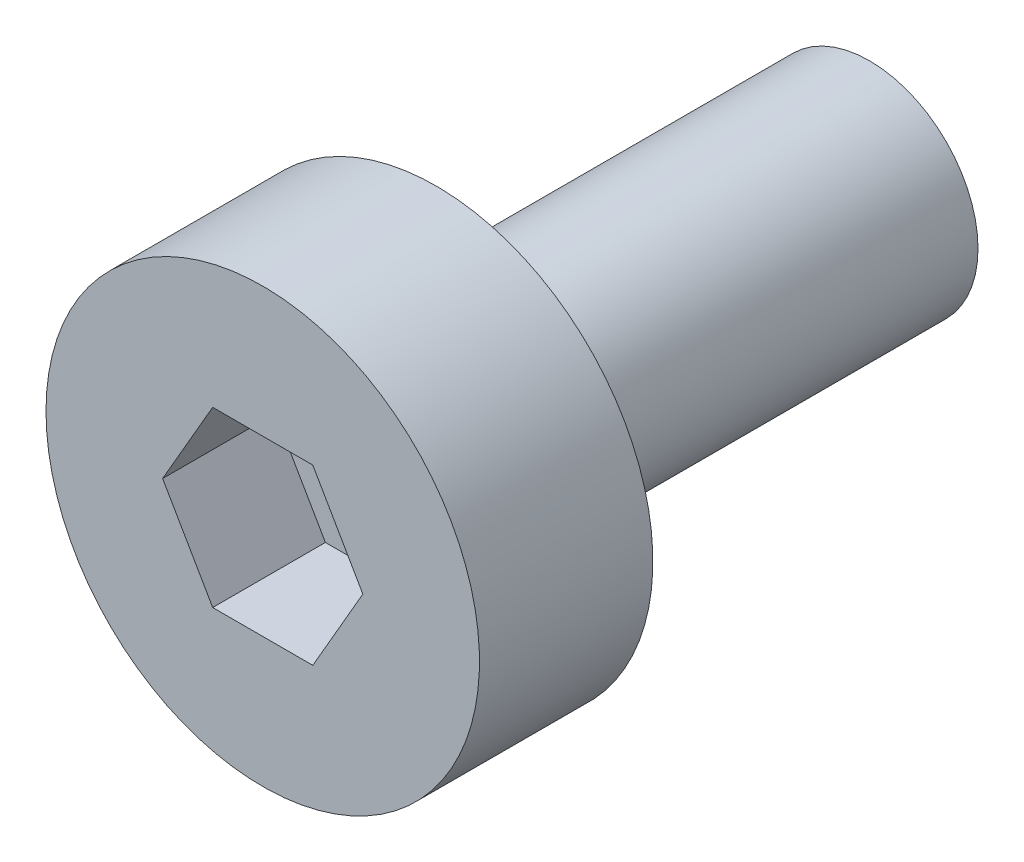
ISO-10303-21;
HEADER;
FILE_DESCRIPTION(('STEP AP214'),'2;1');
FILE_NAME('part.step','',(''),(''),'','','');
FILE_SCHEMA(('AUTOMOTIVE_DESIGN { 1 0 10303 214 1 1 1 1 }'));
ENDSEC;
DATA;
#1=APPLICATION_CONTEXT('core data for automotive mechanical design processes');
#2=APPLICATION_PROTOCOL_DEFINITION('international standard','automotive_design',2000,#1);
#3=PRODUCT_CONTEXT('',#1,'mechanical');
#4=PRODUCT('Part','Part','',(#3));
#5=PRODUCT_RELATED_PRODUCT_CATEGORY('part','',(#4));
#6=PRODUCT_DEFINITION_FORMATION('','',#4);
#7=PRODUCT_DEFINITION_CONTEXT('part definition',#1,'design');
#8=PRODUCT_DEFINITION('design','',#6,#7);
#9=PRODUCT_DEFINITION_SHAPE('','',#8);
#10=(LENGTH_UNIT() NAMED_UNIT(*) SI_UNIT(.MILLI.,.METRE.));
#11=(NAMED_UNIT(*) PLANE_ANGLE_UNIT() SI_UNIT($,.RADIAN.));
#12=(NAMED_UNIT(*) SI_UNIT($,.STERADIAN.) SOLID_ANGLE_UNIT());
#13=UNCERTAINTY_MEASURE_WITH_UNIT(LENGTH_MEASURE(1.E-05),#10,'distance_accuracy_value','');
#14=(GEOMETRIC_REPRESENTATION_CONTEXT(3) GLOBAL_UNCERTAINTY_ASSIGNED_CONTEXT((#13)) GLOBAL_UNIT_ASSIGNED_CONTEXT((#10,
#11,#12)) REPRESENTATION_CONTEXT('',''));
#15=CARTESIAN_POINT('',(0.,0.,0.));
#16=DIRECTION('',(0.,0.,1.));
#17=DIRECTION('',(1.,0.,0.));
#18=AXIS2_PLACEMENT_3D('',#15,#16,#17);
#19=CARTESIAN_POINT('',(0.,0.,0.7));
#20=DIRECTION('',(0.,0.,1.));
#21=DIRECTION('',(1.,0.,0.));
#22=AXIS2_PLACEMENT_3D('',#19,#20,#21);
#23=PLANE('',#22);
#24=DIRECTION('',(-0.50000000000019,0.866025403784329,0.));
#25=VECTOR('',#24,1.);
#26=CARTESIAN_POINT('',(1.154700538379,0.,0.7));
#27=LINE('',#26,#25);
#28=CARTESIAN_POINT('',(1.154700538379,0.,0.7));
#29=VERTEX_POINT('',#28);
#30=CARTESIAN_POINT('',(0.57735026919,1.,0.7));
#31=VERTEX_POINT('',#30);
#32=EDGE_CURVE('E10',#29,#31,#27,.T.);
#33=ORIENTED_EDGE('',*,*,#32,.T.);
#34=DIRECTION('',(-1.,0.,0.));
#35=VECTOR('',#34,1.);
#36=CARTESIAN_POINT('',(0.57735026919,1.,0.7));
#37=LINE('',#36,#35);
#38=CARTESIAN_POINT('',(-0.57735026919,1.,0.7));
#39=VERTEX_POINT('',#38);
#40=EDGE_CURVE('E126',#31,#39,#37,.T.);
#41=ORIENTED_EDGE('',*,*,#40,.T.);
#42=DIRECTION('',(-0.50000000000019,-0.866025403784329,0.));
#43=VECTOR('',#42,1.);
#44=CARTESIAN_POINT('',(-0.57735026919,1.,0.7));
#45=LINE('',#44,#43);
#46=CARTESIAN_POINT('',(-1.154700538379,0.,0.7));
#47=VERTEX_POINT('',#46);
#48=EDGE_CURVE('E130',#39,#47,#45,.T.);
#49=ORIENTED_EDGE('',*,*,#48,.T.);
#50=DIRECTION('',(0.50000000000019,-0.866025403784329,0.));
#51=VECTOR('',#50,1.);
#52=CARTESIAN_POINT('',(-1.154700538379,0.,0.7));
#53=LINE('',#52,#51);
#54=CARTESIAN_POINT('',(-0.57735026919,-1.,0.7));
#55=VERTEX_POINT('',#54);
#56=EDGE_CURVE('E147',#47,#55,#53,.T.);
#57=ORIENTED_EDGE('',*,*,#56,.T.);
#58=DIRECTION('',(1.,0.,0.));
#59=VECTOR('',#58,1.);
#60=CARTESIAN_POINT('',(-0.57735026919,-1.,0.7));
#61=LINE('',#60,#59);
#62=CARTESIAN_POINT('',(0.57735026919,-1.,0.7));
#63=VERTEX_POINT('',#62);
#64=EDGE_CURVE('E148',#55,#63,#61,.T.);
#65=ORIENTED_EDGE('',*,*,#64,.T.);
#66=DIRECTION('',(0.50000000000019,0.866025403784329,0.));
#67=VECTOR('',#66,1.);
#68=CARTESIAN_POINT('',(0.57735026919,-1.,0.7));
#69=LINE('',#68,#67);
#70=EDGE_CURVE('E162',#63,#29,#69,.T.);
#71=ORIENTED_EDGE('',*,*,#70,.T.);
#72=EDGE_LOOP('',(#33,#41,#49,#57,#65,#71));
#73=FACE_BOUND('',#72,.T.);
#74=ADVANCED_FACE('F15',(#73),#23,.T.);
#75=CARTESIAN_POINT('',(0.,0.,-5.));
#76=DIRECTION('',(0.,0.,-1.));
#77=DIRECTION('',(0.,-1.,0.));
#78=AXIS2_PLACEMENT_3D('',#75,#76,#77);
#79=PLANE('',#78);
#80=CARTESIAN_POINT('',(0.,0.,-5.));
#81=DIRECTION('',(0.,0.,-1.));
#82=DIRECTION('',(-1.,0.,0.));
#83=AXIS2_PLACEMENT_3D('',#80,#81,#82);
#84=CIRCLE('',#83,1.25);
#85=CARTESIAN_POINT('',(-1.25,0.,-5.));
#86=VERTEX_POINT('',#85);
#87=EDGE_CURVE('E122',#86,#86,#84,.T.);
#88=ORIENTED_EDGE('',*,*,#87,.T.);
#89=EDGE_LOOP('',(#88));
#90=FACE_BOUND('',#89,.T.);
#91=ADVANCED_FACE('F220',(#90),#79,.T.);
#92=CARTESIAN_POINT('',(1.154700538379,0.,0.7));
#93=DIRECTION('',(-0.866025403784329,-0.50000000000019,0.));
#94=DIRECTION('',(-0.50000000000019,0.866025403784329,0.));
#95=AXIS2_PLACEMENT_3D('',#92,#93,#94);
#96=PLANE('',#95);
#97=ORIENTED_EDGE('',*,*,#32,.F.);
#98=DIRECTION('',(0.,0.,1.));
#99=VECTOR('',#98,1.);
#100=CARTESIAN_POINT('',(1.154700538379,0.,0.7));
#101=LINE('',#100,#99);
#102=CARTESIAN_POINT('',(1.154700538379,0.,2.));
#103=VERTEX_POINT('',#102);
#104=EDGE_CURVE('E120',#29,#103,#101,.T.);
#105=ORIENTED_EDGE('',*,*,#104,.T.);
#106=DIRECTION('',(-0.50000000000019,0.866025403784329,0.));
#107=VECTOR('',#106,1.);
#108=CARTESIAN_POINT('',(1.010362971082,0.25,2.));
#109=LINE('',#108,#107);
#110=CARTESIAN_POINT('',(0.57735026919,1.,2.));
#111=VERTEX_POINT('',#110);
#112=EDGE_CURVE('E155',#103,#111,#109,.T.);
#113=ORIENTED_EDGE('',*,*,#112,.T.);
#114=DIRECTION('',(0.,0.,1.));
#115=VECTOR('',#114,1.);
#116=CARTESIAN_POINT('',(0.57735026919,1.,0.7));
#117=LINE('',#116,#115);
#118=EDGE_CURVE('E19',#31,#111,#117,.T.);
#119=ORIENTED_EDGE('',*,*,#118,.F.);
#120=EDGE_LOOP('',(#97,#105,#113,#119));
#121=FACE_BOUND('',#120,.T.);
#122=ADVANCED_FACE('F17',(#121),#96,.T.);
#123=CARTESIAN_POINT('',(0.57735026919,1.,0.7));
#124=DIRECTION('',(0.,-1.,0.));
#125=DIRECTION('',(-1.,0.,0.));
#126=AXIS2_PLACEMENT_3D('',#123,#124,#125);
#127=PLANE('',#126);
#128=ORIENTED_EDGE('',*,*,#40,.F.);
#129=ORIENTED_EDGE('',*,*,#118,.T.);
#130=DIRECTION('',(-1.,0.,0.));
#131=VECTOR('',#130,1.);
#132=CARTESIAN_POINT('',(0.288675134595,1.,2.));
#133=LINE('',#132,#131);
#134=CARTESIAN_POINT('',(-0.57735026919,1.,2.));
#135=VERTEX_POINT('',#134);
#136=EDGE_CURVE('E159',#111,#135,#133,.T.);
#137=ORIENTED_EDGE('',*,*,#136,.T.);
#138=DIRECTION('',(0.,0.,1.));
#139=VECTOR('',#138,1.);
#140=CARTESIAN_POINT('',(-0.57735026919,1.,0.7));
#141=LINE('',#140,#139);
#142=EDGE_CURVE('E129',#39,#135,#141,.T.);
#143=ORIENTED_EDGE('',*,*,#142,.F.);
#144=EDGE_LOOP('',(#128,#129,#137,#143));
#145=FACE_BOUND('',#144,.T.);
#146=ADVANCED_FACE('F190',(#145),#127,.T.);
#147=CARTESIAN_POINT('',(-0.57735026919,1.,0.7));
#148=DIRECTION('',(0.866025403784329,-0.50000000000019,0.));
#149=DIRECTION('',(0.,0.,-1.));
#150=AXIS2_PLACEMENT_3D('',#147,#148,#149);
#151=PLANE('',#150);
#152=ORIENTED_EDGE('',*,*,#48,.F.);
#153=ORIENTED_EDGE('',*,*,#142,.T.);
#154=DIRECTION('',(-0.50000000000019,-0.866025403784329,0.));
#155=VECTOR('',#154,1.);
#156=CARTESIAN_POINT('',(-0.721687836487,0.75,2.));
#157=LINE('',#156,#155);
#158=CARTESIAN_POINT('',(-1.154700538379,0.,2.));
#159=VERTEX_POINT('',#158);
#160=EDGE_CURVE('E154',#135,#159,#157,.T.);
#161=ORIENTED_EDGE('',*,*,#160,.T.);
#162=DIRECTION('',(0.,0.,1.));
#163=VECTOR('',#162,1.);
#164=CARTESIAN_POINT('',(-1.154700538379,0.,0.7));
#165=LINE('',#164,#163);
#166=EDGE_CURVE('E133',#47,#159,#165,.T.);
#167=ORIENTED_EDGE('',*,*,#166,.F.);
#168=EDGE_LOOP('',(#152,#153,#161,#167));
#169=FACE_BOUND('',#168,.T.);
#170=ADVANCED_FACE('F200',(#169),#151,.T.);
#171=CARTESIAN_POINT('',(-1.154700538379,0.,0.7));
#172=DIRECTION('',(0.866025403784329,0.50000000000019,0.));
#173=DIRECTION('',(0.,0.,-1.));
#174=AXIS2_PLACEMENT_3D('',#171,#172,#173);
#175=PLANE('',#174);
#176=ORIENTED_EDGE('',*,*,#56,.F.);
#177=ORIENTED_EDGE('',*,*,#166,.T.);
#178=DIRECTION('',(0.50000000000019,-0.866025403784329,0.));
#179=VECTOR('',#178,1.);
#180=CARTESIAN_POINT('',(-1.010362971082,-0.25,2.));
#181=LINE('',#180,#179);
#182=CARTESIAN_POINT('',(-0.57735026919,-1.,2.));
#183=VERTEX_POINT('',#182);
#184=EDGE_CURVE('E143',#159,#183,#181,.T.);
#185=ORIENTED_EDGE('',*,*,#184,.T.);
#186=DIRECTION('',(0.,0.,1.));
#187=VECTOR('',#186,1.);
#188=CARTESIAN_POINT('',(-0.57735026919,-1.,0.7));
#189=LINE('',#188,#187);
#190=EDGE_CURVE('E144',#55,#183,#189,.T.);
#191=ORIENTED_EDGE('',*,*,#190,.F.);
#192=EDGE_LOOP('',(#176,#177,#185,#191));
#193=FACE_BOUND('',#192,.T.);
#194=ADVANCED_FACE('F206',(#193),#175,.T.);
#195=CARTESIAN_POINT('',(-0.57735026919,-1.,0.7));
#196=DIRECTION('',(0.,1.,0.));
#197=DIRECTION('',(1.,0.,0.));
#198=AXIS2_PLACEMENT_3D('',#195,#196,#197);
#199=PLANE('',#198);
#200=ORIENTED_EDGE('',*,*,#64,.F.);
#201=ORIENTED_EDGE('',*,*,#190,.T.);
#202=DIRECTION('',(1.,0.,0.));
#203=VECTOR('',#202,1.);
#204=CARTESIAN_POINT('',(-0.288675134595,-1.,2.));
#205=LINE('',#204,#203);
#206=CARTESIAN_POINT('',(0.57735026919,-1.,2.));
#207=VERTEX_POINT('',#206);
#208=EDGE_CURVE('E139',#183,#207,#205,.T.);
#209=ORIENTED_EDGE('',*,*,#208,.T.);
#210=DIRECTION('',(0.,0.,1.));
#211=VECTOR('',#210,1.);
#212=CARTESIAN_POINT('',(0.57735026919,-1.,0.7));
#213=LINE('',#212,#211);
#214=EDGE_CURVE('E166',#63,#207,#213,.T.);
#215=ORIENTED_EDGE('',*,*,#214,.F.);
#216=EDGE_LOOP('',(#200,#201,#209,#215));
#217=FACE_BOUND('',#216,.T.);
#218=ADVANCED_FACE('F208',(#217),#199,.T.);
#219=CARTESIAN_POINT('',(0.57735026919,-1.,0.7));
#220=DIRECTION('',(-0.866025403784329,0.50000000000019,0.));
#221=DIRECTION('',(0.,0.,1.));
#222=AXIS2_PLACEMENT_3D('',#219,#220,#221);
#223=PLANE('',#222);
#224=ORIENTED_EDGE('',*,*,#70,.F.);
#225=ORIENTED_EDGE('',*,*,#214,.T.);
#226=DIRECTION('',(0.50000000000019,0.866025403784329,0.));
#227=VECTOR('',#226,1.);
#228=CARTESIAN_POINT('',(0.721687836487,-0.75,2.));
#229=LINE('',#228,#227);
#230=EDGE_CURVE('E125',#207,#103,#229,.T.);
#231=ORIENTED_EDGE('',*,*,#230,.T.);
#232=ORIENTED_EDGE('',*,*,#104,.F.);
#233=EDGE_LOOP('',(#224,#225,#231,#232));
#234=FACE_BOUND('',#233,.T.);
#235=ADVANCED_FACE('F212',(#234),#223,.T.);
#236=CARTESIAN_POINT('',(0.,0.,0.));
#237=DIRECTION('',(0.,0.,-1.));
#238=DIRECTION('',(-1.,0.,0.));
#239=AXIS2_PLACEMENT_3D('',#236,#237,#238);
#240=CYLINDRICAL_SURFACE('',#239,1.25);
#241=ORIENTED_EDGE('',*,*,#87,.F.);
#242=DIRECTION('',(0.,0.,-1.));
#243=VECTOR('',#242,1.);
#244=CARTESIAN_POINT('',(-1.25,0.,0.));
#245=LINE('',#244,#243);
#246=CARTESIAN_POINT('',(-1.25,0.,0.));
#247=VERTEX_POINT('',#246);
#248=EDGE_CURVE('E93',#247,#86,#245,.T.);
#249=ORIENTED_EDGE('',*,*,#248,.F.);
#250=CARTESIAN_POINT('',(0.,0.,0.));
#251=DIRECTION('',(0.,0.,-1.));
#252=DIRECTION('',(-1.,0.,0.));
#253=AXIS2_PLACEMENT_3D('',#250,#251,#252);
#254=CIRCLE('',#253,1.25);
#255=EDGE_CURVE('E138',#247,#247,#254,.T.);
#256=ORIENTED_EDGE('',*,*,#255,.T.);
#257=ORIENTED_EDGE('',*,*,#248,.T.);
#258=EDGE_LOOP('',(#241,#249,#256,#257));
#259=FACE_BOUND('',#258,.T.);
#260=ADVANCED_FACE('F240',(#259),#240,.T.);
#261=CARTESIAN_POINT('',(0.,0.,2.));
#262=DIRECTION('',(0.,0.,-1.));
#263=DIRECTION('',(0.,-1.,0.));
#264=AXIS2_PLACEMENT_3D('',#261,#262,#263);
#265=PLANE('',#264);
#266=ORIENTED_EDGE('',*,*,#208,.F.);
#267=ORIENTED_EDGE('',*,*,#184,.F.);
#268=ORIENTED_EDGE('',*,*,#160,.F.);
#269=ORIENTED_EDGE('',*,*,#136,.F.);
#270=ORIENTED_EDGE('',*,*,#112,.F.);
#271=ORIENTED_EDGE('',*,*,#230,.F.);
#272=EDGE_LOOP('',(#266,#267,#268,#269,#270,#271));
#273=FACE_BOUND('',#272,.T.);
#274=CARTESIAN_POINT('',(0.,0.,2.));
#275=DIRECTION('',(0.,0.,-1.));
#276=DIRECTION('',(-1.,0.,0.));
#277=AXIS2_PLACEMENT_3D('',#274,#275,#276);
#278=CIRCLE('',#277,2.5);
#279=CARTESIAN_POINT('',(-2.5,0.,2.));
#280=VERTEX_POINT('',#279);
#281=EDGE_CURVE('E101',#280,#280,#278,.T.);
#282=ORIENTED_EDGE('',*,*,#281,.F.);
#283=EDGE_LOOP('',(#282));
#284=FACE_BOUND('',#283,.T.);
#285=ADVANCED_FACE('F196',(#273,#284),#265,.F.);
#286=CARTESIAN_POINT('',(0.,0.,0.));
#287=DIRECTION('',(0.,0.,-1.));
#288=DIRECTION('',(0.,-1.,0.));
#289=AXIS2_PLACEMENT_3D('',#286,#287,#288);
#290=PLANE('',#289);
#291=ORIENTED_EDGE('',*,*,#255,.F.);
#292=EDGE_LOOP('',(#291));
#293=FACE_BOUND('',#292,.T.);
#294=CARTESIAN_POINT('',(0.,0.,0.));
#295=DIRECTION('',(0.,0.,-1.));
#296=DIRECTION('',(-1.,0.,0.));
#297=AXIS2_PLACEMENT_3D('',#294,#295,#296);
#298=CIRCLE('',#297,2.5);
#299=CARTESIAN_POINT('',(-2.5,0.,0.));
#300=VERTEX_POINT('',#299);
#301=EDGE_CURVE('E108',#300,#300,#298,.T.);
#302=ORIENTED_EDGE('',*,*,#301,.T.);
#303=EDGE_LOOP('',(#302));
#304=FACE_BOUND('',#303,.T.);
#305=ADVANCED_FACE('F112',(#293,#304),#290,.T.);
#306=CARTESIAN_POINT('',(0.,0.,2.));
#307=DIRECTION('',(0.,0.,-1.));
#308=DIRECTION('',(-1.,0.,0.));
#309=AXIS2_PLACEMENT_3D('',#306,#307,#308);
#310=CYLINDRICAL_SURFACE('',#309,2.5);
#311=ORIENTED_EDGE('',*,*,#301,.F.);
#312=DIRECTION('',(0.,0.,-1.));
#313=VECTOR('',#312,1.);
#314=CARTESIAN_POINT('',(-2.5,0.,2.));
#315=LINE('',#314,#313);
#316=EDGE_CURVE('E105',#280,#300,#315,.T.);
#317=ORIENTED_EDGE('',*,*,#316,.F.);
#318=ORIENTED_EDGE('',*,*,#281,.T.);
#319=ORIENTED_EDGE('',*,*,#316,.T.);
#320=EDGE_LOOP('',(#311,#317,#318,#319));
#321=FACE_BOUND('',#320,.T.);
#322=ADVANCED_FACE('F107',(#321),#310,.T.);
#323=CLOSED_SHELL('',(#74,#91,#122,#146,#170,#194,#218,#235,#260,#285,#305,#322));
#324=MANIFOLD_SOLID_BREP('B1',#323);
#325=ADVANCED_BREP_SHAPE_REPRESENTATION('',(#18,#324),#14);
#326=SHAPE_DEFINITION_REPRESENTATION(#9,#325);
ENDSEC;
END-ISO-10303-21;
